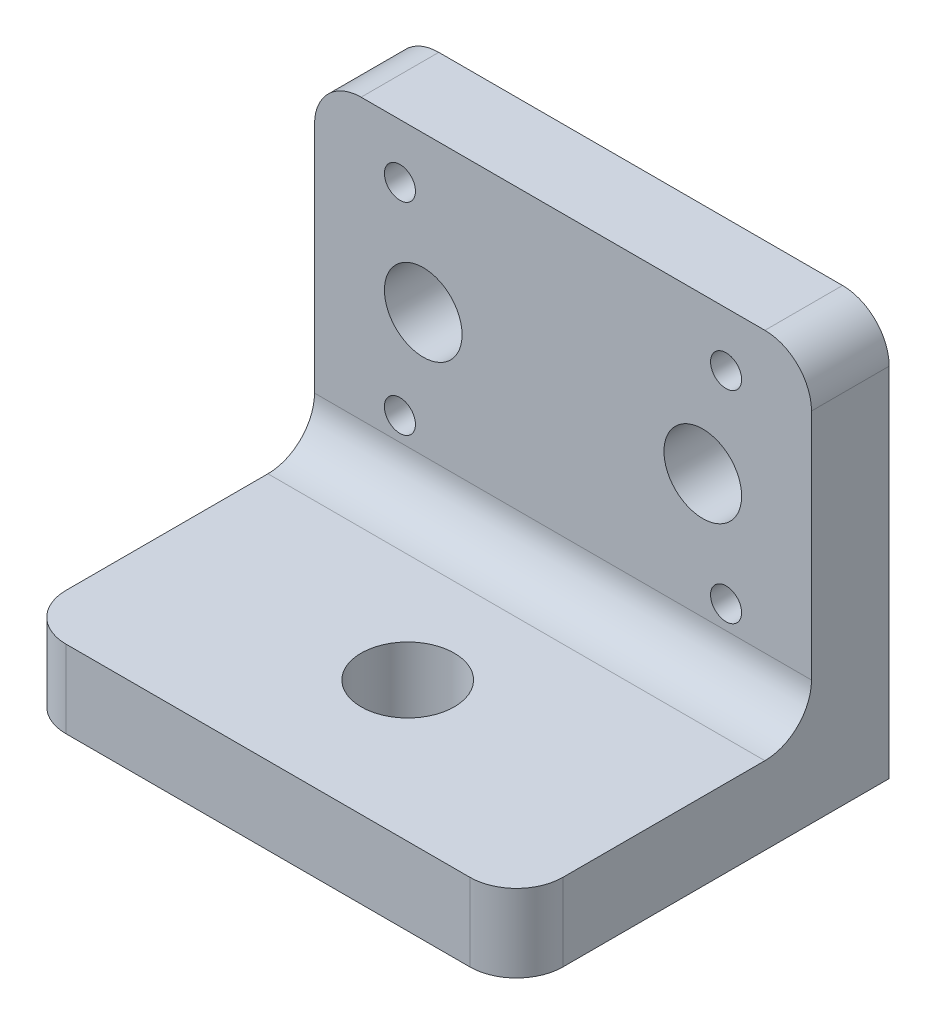
ISO-10303-21;
HEADER;
FILE_DESCRIPTION(('STEP AP214'),'2;1');
FILE_NAME('part.step','',(''),(''),'','','');
FILE_SCHEMA(('AUTOMOTIVE_DESIGN { 1 0 10303 214 1 1 1 1 }'));
ENDSEC;
DATA;
#1=APPLICATION_CONTEXT('core data for automotive mechanical design processes');
#2=APPLICATION_PROTOCOL_DEFINITION('international standard','automotive_design',2000,#1);
#3=PRODUCT_CONTEXT('',#1,'mechanical');
#4=PRODUCT('Part','Part','',(#3));
#5=PRODUCT_RELATED_PRODUCT_CATEGORY('part','',(#4));
#6=PRODUCT_DEFINITION_FORMATION('','',#4);
#7=PRODUCT_DEFINITION_CONTEXT('part definition',#1,'design');
#8=PRODUCT_DEFINITION('design','',#6,#7);
#9=PRODUCT_DEFINITION_SHAPE('','',#8);
#10=(LENGTH_UNIT() NAMED_UNIT(*) SI_UNIT(.MILLI.,.METRE.));
#11=(NAMED_UNIT(*) PLANE_ANGLE_UNIT() SI_UNIT($,.RADIAN.));
#12=(NAMED_UNIT(*) SI_UNIT($,.STERADIAN.) SOLID_ANGLE_UNIT());
#13=UNCERTAINTY_MEASURE_WITH_UNIT(LENGTH_MEASURE(1.E-05),#10,'distance_accuracy_value','');
#14=(GEOMETRIC_REPRESENTATION_CONTEXT(3) GLOBAL_UNCERTAINTY_ASSIGNED_CONTEXT((#13)) GLOBAL_UNIT_ASSIGNED_CONTEXT((#10,
#11,#12)) REPRESENTATION_CONTEXT('',''));
#15=CARTESIAN_POINT('',(0.,0.,0.));
#16=DIRECTION('',(0.,0.,1.));
#17=DIRECTION('',(1.,0.,0.));
#18=AXIS2_PLACEMENT_3D('',#15,#16,#17);
#19=CARTESIAN_POINT('',(-16.,16.,5.));
#20=DIRECTION('',(1.,0.,0.));
#21=DIRECTION('',(0.,0.,-1.));
#22=AXIS2_PLACEMENT_3D('',#19,#20,#21);
#23=PLANE('',#22);
#24=DIRECTION('',(0.,-1.,0.));
#25=VECTOR('',#24,1.);
#26=CARTESIAN_POINT('',(-16.,16.,5.));
#27=LINE('',#26,#25);
#28=CARTESIAN_POINT('',(-16.,7.,5.));
#29=VERTEX_POINT('',#28);
#30=CARTESIAN_POINT('',(-16.,-8.,5.));
#31=VERTEX_POINT('',#30);
#32=EDGE_CURVE('E145',#29,#31,#27,.T.);
#33=ORIENTED_EDGE('',*,*,#32,.F.);
#34=DIRECTION('',(0.,0.,1.));
#35=VECTOR('',#34,1.);
#36=CARTESIAN_POINT('',(-16.,7.,0.));
#37=LINE('',#36,#35);
#38=CARTESIAN_POINT('',(-16.,7.,0.));
#39=VERTEX_POINT('',#38);
#40=EDGE_CURVE('E135',#29,#39,#37,.F.);
#41=ORIENTED_EDGE('',*,*,#40,.T.);
#42=DIRECTION('',(0.,-1.,0.));
#43=VECTOR('',#42,1.);
#44=CARTESIAN_POINT('',(-16.,16.,0.));
#45=LINE('',#44,#43);
#46=CARTESIAN_POINT('',(-16.,-16.,0.));
#47=VERTEX_POINT('',#46);
#48=EDGE_CURVE('E132',#39,#47,#45,.T.);
#49=ORIENTED_EDGE('',*,*,#48,.T.);
#50=DIRECTION('',(0.,0.,-1.));
#51=VECTOR('',#50,1.);
#52=CARTESIAN_POINT('',(-16.,-16.,5.));
#53=LINE('',#52,#51);
#54=CARTESIAN_POINT('',(-16.,-16.,21.));
#55=VERTEX_POINT('',#54);
#56=EDGE_CURVE('E117',#55,#47,#53,.T.);
#57=ORIENTED_EDGE('',*,*,#56,.F.);
#58=DIRECTION('',(0.,-1.,0.));
#59=VECTOR('',#58,1.);
#60=CARTESIAN_POINT('',(-16.,16.,21.));
#61=LINE('',#60,#59);
#62=CARTESIAN_POINT('',(-16.,-11.,21.));
#63=VERTEX_POINT('',#62);
#64=EDGE_CURVE('E170',#55,#63,#61,.F.);
#65=ORIENTED_EDGE('',*,*,#64,.T.);
#66=DIRECTION('',(0.,0.,-1.));
#67=VECTOR('',#66,1.);
#68=CARTESIAN_POINT('',(-16.,-11.,24.));
#69=LINE('',#68,#67);
#70=CARTESIAN_POINT('',(-16.,-11.,8.));
#71=VERTEX_POINT('',#70);
#72=EDGE_CURVE('E187',#63,#71,#69,.T.);
#73=ORIENTED_EDGE('',*,*,#72,.T.);
#74=CARTESIAN_POINT('',(-16.,-8.,8.));
#75=DIRECTION('',(1.,0.,0.));
#76=DIRECTION('',(0.,0.,-1.));
#77=AXIS2_PLACEMENT_3D('',#74,#75,#76);
#78=CIRCLE('',#77,3.);
#79=EDGE_CURVE('E40',#71,#31,#78,.T.);
#80=ORIENTED_EDGE('',*,*,#79,.T.);
#81=EDGE_LOOP('',(#33,#41,#49,#57,#65,#73,#80));
#82=FACE_BOUND('',#81,.T.);
#83=ADVANCED_FACE('F32',(#82),#23,.F.);
#84=CARTESIAN_POINT('',(16.,16.,5.));
#85=DIRECTION('',(-1.,0.,0.));
#86=DIRECTION('',(0.,0.,1.));
#87=AXIS2_PLACEMENT_3D('',#84,#85,#86);
#88=PLANE('',#87);
#89=DIRECTION('',(0.,1.,0.));
#90=VECTOR('',#89,1.);
#91=CARTESIAN_POINT('',(16.,16.,0.));
#92=LINE('',#91,#90);
#93=CARTESIAN_POINT('',(16.,-16.,0.));
#94=VERTEX_POINT('',#93);
#95=CARTESIAN_POINT('',(16.,7.,0.));
#96=VERTEX_POINT('',#95);
#97=EDGE_CURVE('E143',#94,#96,#92,.T.);
#98=ORIENTED_EDGE('',*,*,#97,.T.);
#99=DIRECTION('',(0.,0.,-1.));
#100=VECTOR('',#99,1.);
#101=CARTESIAN_POINT('',(16.,7.,5.));
#102=LINE('',#101,#100);
#103=CARTESIAN_POINT('',(16.,7.,5.));
#104=VERTEX_POINT('',#103);
#105=EDGE_CURVE('E162',#96,#104,#102,.F.);
#106=ORIENTED_EDGE('',*,*,#105,.T.);
#107=DIRECTION('',(0.,1.,0.));
#108=VECTOR('',#107,1.);
#109=CARTESIAN_POINT('',(16.,16.,5.));
#110=LINE('',#109,#108);
#111=CARTESIAN_POINT('',(16.,-8.,5.));
#112=VERTEX_POINT('',#111);
#113=EDGE_CURVE('E149',#112,#104,#110,.T.);
#114=ORIENTED_EDGE('',*,*,#113,.F.);
#115=CARTESIAN_POINT('',(16.,-8.,8.));
#116=DIRECTION('',(-1.,0.,0.));
#117=DIRECTION('',(0.,0.,1.));
#118=AXIS2_PLACEMENT_3D('',#115,#116,#117);
#119=CIRCLE('',#118,3.);
#120=CARTESIAN_POINT('',(16.,-11.,8.));
#121=VERTEX_POINT('',#120);
#122=EDGE_CURVE('E11',#112,#121,#119,.T.);
#123=ORIENTED_EDGE('',*,*,#122,.T.);
#124=DIRECTION('',(0.,0.,-1.));
#125=VECTOR('',#124,1.);
#126=CARTESIAN_POINT('',(16.,-11.,24.));
#127=LINE('',#126,#125);
#128=CARTESIAN_POINT('',(16.,-11.,21.));
#129=VERTEX_POINT('',#128);
#130=EDGE_CURVE('E202',#129,#121,#127,.T.);
#131=ORIENTED_EDGE('',*,*,#130,.F.);
#132=DIRECTION('',(0.,1.,0.));
#133=VECTOR('',#132,1.);
#134=CARTESIAN_POINT('',(16.,16.,21.));
#135=LINE('',#134,#133);
#136=CARTESIAN_POINT('',(16.,-16.,21.));
#137=VERTEX_POINT('',#136);
#138=EDGE_CURVE('E160',#129,#137,#135,.F.);
#139=ORIENTED_EDGE('',*,*,#138,.T.);
#140=DIRECTION('',(0.,0.,-1.));
#141=VECTOR('',#140,1.);
#142=CARTESIAN_POINT('',(16.,-16.,5.));
#143=LINE('',#142,#141);
#144=EDGE_CURVE('E129',#137,#94,#143,.T.);
#145=ORIENTED_EDGE('',*,*,#144,.T.);
#146=EDGE_LOOP('',(#98,#106,#114,#123,#131,#139,#145));
#147=FACE_BOUND('',#146,.T.);
#148=ADVANCED_FACE('F201',(#147),#88,.F.);
#149=CARTESIAN_POINT('',(0.,0.,5.));
#150=DIRECTION('',(0.,0.,1.));
#151=DIRECTION('',(1.,0.,0.));
#152=AXIS2_PLACEMENT_3D('',#149,#150,#151);
#153=PLANE('',#152);
#154=CARTESIAN_POINT('',(-10.5,6.5,5.));
#155=DIRECTION('',(0.,0.,1.));
#156=DIRECTION('',(1.,0.,0.));
#157=AXIS2_PLACEMENT_3D('',#154,#155,#156);
#158=CIRCLE('',#157,0.99999999999999);
#159=CARTESIAN_POINT('',(-9.50000000000001,6.5,5.));
#160=VERTEX_POINT('',#159);
#161=EDGE_CURVE('E205',#160,#160,#158,.T.);
#162=ORIENTED_EDGE('',*,*,#161,.F.);
#163=EDGE_LOOP('',(#162));
#164=FACE_BOUND('',#163,.T.);
#165=CARTESIAN_POINT('',(10.5,6.5,5.));
#166=DIRECTION('',(0.,0.,1.));
#167=DIRECTION('',(1.,0.,0.));
#168=AXIS2_PLACEMENT_3D('',#165,#166,#167);
#169=CIRCLE('',#168,0.99999999999999);
#170=CARTESIAN_POINT('',(11.5,6.5,5.));
#171=VERTEX_POINT('',#170);
#172=EDGE_CURVE('E216',#171,#171,#169,.T.);
#173=ORIENTED_EDGE('',*,*,#172,.F.);
#174=EDGE_LOOP('',(#173));
#175=FACE_BOUND('',#174,.T.);
#176=CARTESIAN_POINT('',(10.5,-6.5,5.));
#177=DIRECTION('',(0.,0.,1.));
#178=DIRECTION('',(1.,0.,0.));
#179=AXIS2_PLACEMENT_3D('',#176,#177,#178);
#180=CIRCLE('',#179,0.99999999999999);
#181=CARTESIAN_POINT('',(11.5,-6.5,5.));
#182=VERTEX_POINT('',#181);
#183=EDGE_CURVE('E222',#182,#182,#180,.T.);
#184=ORIENTED_EDGE('',*,*,#183,.F.);
#185=EDGE_LOOP('',(#184));
#186=FACE_BOUND('',#185,.T.);
#187=CARTESIAN_POINT('',(-10.5,-6.5,5.));
#188=DIRECTION('',(0.,0.,1.));
#189=DIRECTION('',(1.,0.,0.));
#190=AXIS2_PLACEMENT_3D('',#187,#188,#189);
#191=CIRCLE('',#190,0.99999999999999);
#192=CARTESIAN_POINT('',(-9.50000000000001,-6.5,5.));
#193=VERTEX_POINT('',#192);
#194=EDGE_CURVE('E228',#193,#193,#191,.T.);
#195=ORIENTED_EDGE('',*,*,#194,.F.);
#196=EDGE_LOOP('',(#195));
#197=FACE_BOUND('',#196,.T.);
#198=CARTESIAN_POINT('',(-9.,0.,5.));
#199=DIRECTION('',(0.,0.,1.));
#200=DIRECTION('',(1.,0.,0.));
#201=AXIS2_PLACEMENT_3D('',#198,#199,#200);
#202=CIRCLE('',#201,2.49999999999999);
#203=CARTESIAN_POINT('',(-6.50000000000001,0.,5.));
#204=VERTEX_POINT('',#203);
#205=EDGE_CURVE('E234',#204,#204,#202,.T.);
#206=ORIENTED_EDGE('',*,*,#205,.F.);
#207=EDGE_LOOP('',(#206));
#208=FACE_BOUND('',#207,.T.);
#209=CARTESIAN_POINT('',(9.,0.,5.));
#210=DIRECTION('',(0.,0.,1.));
#211=DIRECTION('',(1.,0.,0.));
#212=AXIS2_PLACEMENT_3D('',#209,#210,#211);
#213=CIRCLE('',#212,2.49999999999999);
#214=CARTESIAN_POINT('',(11.5,0.,5.));
#215=VERTEX_POINT('',#214);
#216=EDGE_CURVE('E240',#215,#215,#213,.T.);
#217=ORIENTED_EDGE('',*,*,#216,.F.);
#218=EDGE_LOOP('',(#217));
#219=FACE_BOUND('',#218,.T.);
#220=ORIENTED_EDGE('',*,*,#113,.T.);
#221=CARTESIAN_POINT('',(13.,7.,5.));
#222=DIRECTION('',(0.,0.,1.));
#223=DIRECTION('',(1.,0.,0.));
#224=AXIS2_PLACEMENT_3D('',#221,#222,#223);
#225=CIRCLE('',#224,3.);
#226=CARTESIAN_POINT('',(13.,10.,5.));
#227=VERTEX_POINT('',#226);
#228=EDGE_CURVE('E168',#104,#227,#225,.T.);
#229=ORIENTED_EDGE('',*,*,#228,.T.);
#230=DIRECTION('',(1.,0.,0.));
#231=VECTOR('',#230,1.);
#232=CARTESIAN_POINT('',(-16.,10.,5.));
#233=LINE('',#232,#231);
#234=CARTESIAN_POINT('',(-13.,10.,5.));
#235=VERTEX_POINT('',#234);
#236=EDGE_CURVE('E255',#235,#227,#233,.T.);
#237=ORIENTED_EDGE('',*,*,#236,.F.);
#238=CARTESIAN_POINT('',(-13.,7.,5.));
#239=DIRECTION('',(0.,0.,1.));
#240=DIRECTION('',(1.,0.,0.));
#241=AXIS2_PLACEMENT_3D('',#238,#239,#240);
#242=CIRCLE('',#241,3.);
#243=EDGE_CURVE('E166',#235,#29,#242,.T.);
#244=ORIENTED_EDGE('',*,*,#243,.T.);
#245=ORIENTED_EDGE('',*,*,#32,.T.);
#246=DIRECTION('',(-1.,0.,0.));
#247=VECTOR('',#246,1.);
#248=CARTESIAN_POINT('',(0.,-8.,5.));
#249=LINE('',#248,#247);
#250=EDGE_CURVE('E164',#31,#112,#249,.F.);
#251=ORIENTED_EDGE('',*,*,#250,.T.);
#252=EDGE_LOOP('',(#220,#229,#237,#244,#245,#251));
#253=FACE_BOUND('',#252,.T.);
#254=ADVANCED_FACE('F193',(#164,#175,#186,#197,#208,#219,#253),#153,.T.);
#255=CARTESIAN_POINT('',(0.,0.,0.));
#256=DIRECTION('',(0.,0.,1.));
#257=DIRECTION('',(1.,0.,0.));
#258=AXIS2_PLACEMENT_3D('',#255,#256,#257);
#259=PLANE('',#258);
#260=CARTESIAN_POINT('',(9.,0.,0.));
#261=DIRECTION('',(0.,0.,1.));
#262=DIRECTION('',(1.,0.,0.));
#263=AXIS2_PLACEMENT_3D('',#260,#261,#262);
#264=CIRCLE('',#263,2.49999999999999);
#265=CARTESIAN_POINT('',(11.5,0.,0.));
#266=VERTEX_POINT('',#265);
#267=EDGE_CURVE('E138',#266,#266,#264,.T.);
#268=ORIENTED_EDGE('',*,*,#267,.T.);
#269=EDGE_LOOP('',(#268));
#270=FACE_BOUND('',#269,.T.);
#271=CARTESIAN_POINT('',(-9.,0.,0.));
#272=DIRECTION('',(0.,0.,1.));
#273=DIRECTION('',(1.,0.,0.));
#274=AXIS2_PLACEMENT_3D('',#271,#272,#273);
#275=CIRCLE('',#274,2.49999999999999);
#276=CARTESIAN_POINT('',(-6.5,0.,0.));
#277=VERTEX_POINT('',#276);
#278=EDGE_CURVE('E237',#277,#277,#275,.T.);
#279=ORIENTED_EDGE('',*,*,#278,.T.);
#280=EDGE_LOOP('',(#279));
#281=FACE_BOUND('',#280,.T.);
#282=CARTESIAN_POINT('',(-10.5,-6.5,0.));
#283=DIRECTION('',(0.,0.,1.));
#284=DIRECTION('',(1.,0.,0.));
#285=AXIS2_PLACEMENT_3D('',#282,#283,#284);
#286=CIRCLE('',#285,0.999999999999995);
#287=CARTESIAN_POINT('',(-9.50000000000001,-6.5,0.));
#288=VERTEX_POINT('',#287);
#289=EDGE_CURVE('E231',#288,#288,#286,.T.);
#290=ORIENTED_EDGE('',*,*,#289,.T.);
#291=EDGE_LOOP('',(#290));
#292=FACE_BOUND('',#291,.T.);
#293=CARTESIAN_POINT('',(10.5,-6.5,0.));
#294=DIRECTION('',(0.,0.,1.));
#295=DIRECTION('',(1.,0.,0.));
#296=AXIS2_PLACEMENT_3D('',#293,#294,#295);
#297=CIRCLE('',#296,0.999999999999995);
#298=CARTESIAN_POINT('',(11.5,-6.5,0.));
#299=VERTEX_POINT('',#298);
#300=EDGE_CURVE('E225',#299,#299,#297,.T.);
#301=ORIENTED_EDGE('',*,*,#300,.T.);
#302=EDGE_LOOP('',(#301));
#303=FACE_BOUND('',#302,.T.);
#304=CARTESIAN_POINT('',(10.5,6.5,0.));
#305=DIRECTION('',(0.,0.,1.));
#306=DIRECTION('',(1.,0.,0.));
#307=AXIS2_PLACEMENT_3D('',#304,#305,#306);
#308=CIRCLE('',#307,0.999999999999995);
#309=CARTESIAN_POINT('',(11.5,6.5,0.));
#310=VERTEX_POINT('',#309);
#311=EDGE_CURVE('E219',#310,#310,#308,.T.);
#312=ORIENTED_EDGE('',*,*,#311,.T.);
#313=EDGE_LOOP('',(#312));
#314=FACE_BOUND('',#313,.T.);
#315=CARTESIAN_POINT('',(-10.5,6.5,0.));
#316=DIRECTION('',(0.,0.,1.));
#317=DIRECTION('',(1.,0.,0.));
#318=AXIS2_PLACEMENT_3D('',#315,#316,#317);
#319=CIRCLE('',#318,0.999999999999995);
#320=CARTESIAN_POINT('',(-9.50000000000001,6.5,0.));
#321=VERTEX_POINT('',#320);
#322=EDGE_CURVE('E208',#321,#321,#319,.T.);
#323=ORIENTED_EDGE('',*,*,#322,.T.);
#324=EDGE_LOOP('',(#323));
#325=FACE_BOUND('',#324,.T.);
#326=DIRECTION('',(-1.,0.,0.));
#327=VECTOR('',#326,1.);
#328=CARTESIAN_POINT('',(16.,10.,0.));
#329=LINE('',#328,#327);
#330=CARTESIAN_POINT('',(13.,10.,0.));
#331=VERTEX_POINT('',#330);
#332=CARTESIAN_POINT('',(-13.,10.,0.));
#333=VERTEX_POINT('',#332);
#334=EDGE_CURVE('E253',#331,#333,#329,.T.);
#335=ORIENTED_EDGE('',*,*,#334,.F.);
#336=CARTESIAN_POINT('',(13.,7.,0.));
#337=DIRECTION('',(0.,0.,1.));
#338=DIRECTION('',(1.,0.,0.));
#339=AXIS2_PLACEMENT_3D('',#336,#337,#338);
#340=CIRCLE('',#339,3.);
#341=EDGE_CURVE('E158',#331,#96,#340,.F.);
#342=ORIENTED_EDGE('',*,*,#341,.T.);
#343=ORIENTED_EDGE('',*,*,#97,.F.);
#344=DIRECTION('',(1.,0.,0.));
#345=VECTOR('',#344,1.);
#346=CARTESIAN_POINT('',(-16.,-16.,0.));
#347=LINE('',#346,#345);
#348=EDGE_CURVE('E123',#47,#94,#347,.T.);
#349=ORIENTED_EDGE('',*,*,#348,.F.);
#350=ORIENTED_EDGE('',*,*,#48,.F.);
#351=CARTESIAN_POINT('',(-13.,7.,0.));
#352=DIRECTION('',(0.,0.,1.));
#353=DIRECTION('',(1.,0.,0.));
#354=AXIS2_PLACEMENT_3D('',#351,#352,#353);
#355=CIRCLE('',#354,3.);
#356=EDGE_CURVE('E156',#39,#333,#355,.F.);
#357=ORIENTED_EDGE('',*,*,#356,.T.);
#358=EDGE_LOOP('',(#335,#342,#343,#349,#350,#357));
#359=FACE_BOUND('',#358,.T.);
#360=ADVANCED_FACE('F141',(#270,#281,#292,#303,#314,#325,#359),#259,.F.);
#361=CARTESIAN_POINT('',(-16.,-11.,24.));
#362=DIRECTION('',(0.,-1.,0.));
#363=DIRECTION('',(0.,0.,-1.));
#364=AXIS2_PLACEMENT_3D('',#361,#362,#363);
#365=PLANE('',#364);
#366=ORIENTED_EDGE('',*,*,#72,.F.);
#367=CARTESIAN_POINT('',(-13.,-11.,21.));
#368=DIRECTION('',(0.,-1.,0.));
#369=DIRECTION('',(0.,0.,-1.));
#370=AXIS2_PLACEMENT_3D('',#367,#368,#369);
#371=CIRCLE('',#370,3.);
#372=CARTESIAN_POINT('',(-13.,-11.,24.));
#373=VERTEX_POINT('',#372);
#374=EDGE_CURVE('E47',#63,#373,#371,.F.);
#375=ORIENTED_EDGE('',*,*,#374,.T.);
#376=DIRECTION('',(-1.,0.,0.));
#377=VECTOR('',#376,1.);
#378=CARTESIAN_POINT('',(-16.,-11.,24.));
#379=LINE('',#378,#377);
#380=CARTESIAN_POINT('',(13.,-11.,24.));
#381=VERTEX_POINT('',#380);
#382=EDGE_CURVE('E210',#381,#373,#379,.T.);
#383=ORIENTED_EDGE('',*,*,#382,.F.);
#384=CARTESIAN_POINT('',(13.,-11.,21.));
#385=DIRECTION('',(0.,-1.,0.));
#386=DIRECTION('',(0.,0.,-1.));
#387=AXIS2_PLACEMENT_3D('',#384,#385,#386);
#388=CIRCLE('',#387,3.);
#389=EDGE_CURVE('E55',#381,#129,#388,.F.);
#390=ORIENTED_EDGE('',*,*,#389,.T.);
#391=ORIENTED_EDGE('',*,*,#130,.T.);
#392=DIRECTION('',(-1.,0.,0.));
#393=VECTOR('',#392,1.);
#394=CARTESIAN_POINT('',(-16.,-11.,8.));
#395=LINE('',#394,#393);
#396=EDGE_CURVE('E181',#121,#71,#395,.T.);
#397=ORIENTED_EDGE('',*,*,#396,.T.);
#398=EDGE_LOOP('',(#366,#375,#383,#390,#391,#397));
#399=FACE_BOUND('',#398,.T.);
#400=CARTESIAN_POINT('',(0.,-11.,15.));
#401=DIRECTION('',(0.,1.,0.));
#402=DIRECTION('',(0.,0.,1.));
#403=AXIS2_PLACEMENT_3D('',#400,#401,#402);
#404=CIRCLE('',#403,3.);
#405=CARTESIAN_POINT('',(0.,-11.,18.));
#406=VERTEX_POINT('',#405);
#407=EDGE_CURVE('E257',#406,#406,#404,.T.);
#408=ORIENTED_EDGE('',*,*,#407,.F.);
#409=EDGE_LOOP('',(#408));
#410=FACE_BOUND('',#409,.T.);
#411=ADVANCED_FACE('F203',(#399,#410),#365,.F.);
#412=CARTESIAN_POINT('',(-16.,-16.,5.));
#413=DIRECTION('',(0.,1.,0.));
#414=DIRECTION('',(0.,0.,1.));
#415=AXIS2_PLACEMENT_3D('',#412,#413,#414);
#416=PLANE('',#415);
#417=CARTESIAN_POINT('',(0.,-16.,15.));
#418=DIRECTION('',(0.,1.,0.));
#419=DIRECTION('',(0.,0.,1.));
#420=AXIS2_PLACEMENT_3D('',#417,#418,#419);
#421=CIRCLE('',#420,3.);
#422=CARTESIAN_POINT('',(0.,-16.,18.));
#423=VERTEX_POINT('',#422);
#424=EDGE_CURVE('E262',#423,#423,#421,.T.);
#425=ORIENTED_EDGE('',*,*,#424,.T.);
#426=EDGE_LOOP('',(#425));
#427=FACE_BOUND('',#426,.T.);
#428=DIRECTION('',(1.,0.,0.));
#429=VECTOR('',#428,1.);
#430=CARTESIAN_POINT('',(-16.,-16.,24.));
#431=LINE('',#430,#429);
#432=CARTESIAN_POINT('',(-13.,-16.,24.));
#433=VERTEX_POINT('',#432);
#434=CARTESIAN_POINT('',(13.,-16.,24.));
#435=VERTEX_POINT('',#434);
#436=EDGE_CURVE('E265',#433,#435,#431,.T.);
#437=ORIENTED_EDGE('',*,*,#436,.F.);
#438=CARTESIAN_POINT('',(-13.,-16.,21.));
#439=DIRECTION('',(0.,1.,0.));
#440=DIRECTION('',(0.,0.,1.));
#441=AXIS2_PLACEMENT_3D('',#438,#439,#440);
#442=CIRCLE('',#441,3.);
#443=EDGE_CURVE('E125',#433,#55,#442,.F.);
#444=ORIENTED_EDGE('',*,*,#443,.T.);
#445=ORIENTED_EDGE('',*,*,#56,.T.);
#446=ORIENTED_EDGE('',*,*,#348,.T.);
#447=ORIENTED_EDGE('',*,*,#144,.F.);
#448=CARTESIAN_POINT('',(13.,-16.,21.));
#449=DIRECTION('',(0.,1.,0.));
#450=DIRECTION('',(0.,0.,1.));
#451=AXIS2_PLACEMENT_3D('',#448,#449,#450);
#452=CIRCLE('',#451,3.);
#453=EDGE_CURVE('E178',#137,#435,#452,.F.);
#454=ORIENTED_EDGE('',*,*,#453,.T.);
#455=EDGE_LOOP('',(#437,#444,#445,#446,#447,#454));
#456=FACE_BOUND('',#455,.T.);
#457=ADVANCED_FACE('F120',(#427,#456),#416,.F.);
#458=CARTESIAN_POINT('',(9.,0.,5.));
#459=DIRECTION('',(0.,0.,1.));
#460=DIRECTION('',(1.,0.,0.));
#461=AXIS2_PLACEMENT_3D('',#458,#459,#460);
#462=CYLINDRICAL_SURFACE('',#461,2.49999999999999);
#463=ORIENTED_EDGE('',*,*,#267,.F.);
#464=EDGE_LOOP('',(#463));
#465=FACE_BOUND('',#464,.T.);
#466=ORIENTED_EDGE('',*,*,#216,.T.);
#467=EDGE_LOOP('',(#466));
#468=FACE_BOUND('',#467,.T.);
#469=ADVANCED_FACE('F325',(#465,#468),#462,.F.);
#470=CARTESIAN_POINT('',(-9.,0.,5.));
#471=DIRECTION('',(0.,0.,1.));
#472=DIRECTION('',(1.,0.,0.));
#473=AXIS2_PLACEMENT_3D('',#470,#471,#472);
#474=CYLINDRICAL_SURFACE('',#473,2.49999999999999);
#475=ORIENTED_EDGE('',*,*,#278,.F.);
#476=EDGE_LOOP('',(#475));
#477=FACE_BOUND('',#476,.T.);
#478=ORIENTED_EDGE('',*,*,#205,.T.);
#479=EDGE_LOOP('',(#478));
#480=FACE_BOUND('',#479,.T.);
#481=ADVANCED_FACE('F321',(#477,#480),#474,.F.);
#482=CARTESIAN_POINT('',(-10.5,-6.5,5.));
#483=DIRECTION('',(0.,0.,1.));
#484=DIRECTION('',(1.,0.,0.));
#485=AXIS2_PLACEMENT_3D('',#482,#483,#484);
#486=CYLINDRICAL_SURFACE('',#485,0.999999999999995);
#487=ORIENTED_EDGE('',*,*,#289,.F.);
#488=EDGE_LOOP('',(#487));
#489=FACE_BOUND('',#488,.T.);
#490=ORIENTED_EDGE('',*,*,#194,.T.);
#491=EDGE_LOOP('',(#490));
#492=FACE_BOUND('',#491,.T.);
#493=ADVANCED_FACE('F317',(#489,#492),#486,.F.);
#494=CARTESIAN_POINT('',(10.5,-6.5,5.));
#495=DIRECTION('',(0.,0.,1.));
#496=DIRECTION('',(1.,0.,0.));
#497=AXIS2_PLACEMENT_3D('',#494,#495,#496);
#498=CYLINDRICAL_SURFACE('',#497,0.999999999999995);
#499=ORIENTED_EDGE('',*,*,#300,.F.);
#500=EDGE_LOOP('',(#499));
#501=FACE_BOUND('',#500,.T.);
#502=ORIENTED_EDGE('',*,*,#183,.T.);
#503=EDGE_LOOP('',(#502));
#504=FACE_BOUND('',#503,.T.);
#505=ADVANCED_FACE('F313',(#501,#504),#498,.F.);
#506=CARTESIAN_POINT('',(10.5,6.5,5.));
#507=DIRECTION('',(0.,0.,1.));
#508=DIRECTION('',(1.,0.,0.));
#509=AXIS2_PLACEMENT_3D('',#506,#507,#508);
#510=CYLINDRICAL_SURFACE('',#509,0.999999999999995);
#511=ORIENTED_EDGE('',*,*,#311,.F.);
#512=EDGE_LOOP('',(#511));
#513=FACE_BOUND('',#512,.T.);
#514=ORIENTED_EDGE('',*,*,#172,.T.);
#515=EDGE_LOOP('',(#514));
#516=FACE_BOUND('',#515,.T.);
#517=ADVANCED_FACE('F309',(#513,#516),#510,.F.);
#518=CARTESIAN_POINT('',(-10.5,6.5,5.));
#519=DIRECTION('',(0.,0.,1.));
#520=DIRECTION('',(1.,0.,0.));
#521=AXIS2_PLACEMENT_3D('',#518,#519,#520);
#522=CYLINDRICAL_SURFACE('',#521,0.999999999999995);
#523=ORIENTED_EDGE('',*,*,#322,.F.);
#524=EDGE_LOOP('',(#523));
#525=FACE_BOUND('',#524,.T.);
#526=ORIENTED_EDGE('',*,*,#161,.T.);
#527=EDGE_LOOP('',(#526));
#528=FACE_BOUND('',#527,.T.);
#529=ADVANCED_FACE('F304',(#525,#528),#522,.F.);
#530=CARTESIAN_POINT('',(0.,0.,24.));
#531=DIRECTION('',(0.,0.,-1.));
#532=DIRECTION('',(-1.,0.,0.));
#533=AXIS2_PLACEMENT_3D('',#530,#531,#532);
#534=PLANE('',#533);
#535=ORIENTED_EDGE('',*,*,#382,.T.);
#536=DIRECTION('',(0.,-1.,0.));
#537=VECTOR('',#536,1.);
#538=CARTESIAN_POINT('',(-13.,0.,24.));
#539=LINE('',#538,#537);
#540=EDGE_CURVE('E175',#373,#433,#539,.T.);
#541=ORIENTED_EDGE('',*,*,#540,.T.);
#542=ORIENTED_EDGE('',*,*,#436,.T.);
#543=DIRECTION('',(0.,1.,0.));
#544=VECTOR('',#543,1.);
#545=CARTESIAN_POINT('',(13.,0.,24.));
#546=LINE('',#545,#544);
#547=EDGE_CURVE('E173',#435,#381,#546,.T.);
#548=ORIENTED_EDGE('',*,*,#547,.T.);
#549=EDGE_LOOP('',(#535,#541,#542,#548));
#550=FACE_BOUND('',#549,.T.);
#551=ADVANCED_FACE('F269',(#550),#534,.F.);
#552=CARTESIAN_POINT('',(0.,-11.,15.));
#553=DIRECTION('',(0.,1.,0.));
#554=DIRECTION('',(0.,0.,1.));
#555=AXIS2_PLACEMENT_3D('',#552,#553,#554);
#556=CYLINDRICAL_SURFACE('',#555,3.);
#557=ORIENTED_EDGE('',*,*,#424,.F.);
#558=EDGE_LOOP('',(#557));
#559=FACE_BOUND('',#558,.T.);
#560=ORIENTED_EDGE('',*,*,#407,.T.);
#561=EDGE_LOOP('',(#560));
#562=FACE_BOUND('',#561,.T.);
#563=ADVANCED_FACE('F294',(#559,#562),#556,.F.);
#564=CARTESIAN_POINT('',(0.,10.,0.));
#565=DIRECTION('',(0.,1.,0.));
#566=DIRECTION('',(0.,0.,1.));
#567=AXIS2_PLACEMENT_3D('',#564,#565,#566);
#568=PLANE('',#567);
#569=ORIENTED_EDGE('',*,*,#236,.T.);
#570=DIRECTION('',(0.,0.,-1.));
#571=VECTOR('',#570,1.);
#572=CARTESIAN_POINT('',(13.,10.,0.));
#573=LINE('',#572,#571);
#574=EDGE_CURVE('E153',#227,#331,#573,.T.);
#575=ORIENTED_EDGE('',*,*,#574,.T.);
#576=ORIENTED_EDGE('',*,*,#334,.T.);
#577=DIRECTION('',(0.,0.,1.));
#578=VECTOR('',#577,1.);
#579=CARTESIAN_POINT('',(-13.,10.,5.));
#580=LINE('',#579,#578);
#581=EDGE_CURVE('E128',#333,#235,#580,.T.);
#582=ORIENTED_EDGE('',*,*,#581,.T.);
#583=EDGE_LOOP('',(#569,#575,#576,#582));
#584=FACE_BOUND('',#583,.T.);
#585=ADVANCED_FACE('F252',(#584),#568,.T.);
#586=CARTESIAN_POINT('',(13.,7.,0.));
#587=DIRECTION('',(0.,0.,1.));
#588=DIRECTION('',(1.,0.,0.));
#589=AXIS2_PLACEMENT_3D('',#586,#587,#588);
#590=CYLINDRICAL_SURFACE('',#589,3.);
#591=ORIENTED_EDGE('',*,*,#228,.F.);
#592=ORIENTED_EDGE('',*,*,#105,.F.);
#593=ORIENTED_EDGE('',*,*,#341,.F.);
#594=ORIENTED_EDGE('',*,*,#574,.F.);
#595=EDGE_LOOP('',(#591,#592,#593,#594));
#596=FACE_BOUND('',#595,.T.);
#597=ADVANCED_FACE('F249',(#596),#590,.T.);
#598=CARTESIAN_POINT('',(-13.,7.,0.));
#599=DIRECTION('',(0.,0.,-1.));
#600=DIRECTION('',(-1.,0.,0.));
#601=AXIS2_PLACEMENT_3D('',#598,#599,#600);
#602=CYLINDRICAL_SURFACE('',#601,3.);
#603=ORIENTED_EDGE('',*,*,#356,.F.);
#604=ORIENTED_EDGE('',*,*,#40,.F.);
#605=ORIENTED_EDGE('',*,*,#243,.F.);
#606=ORIENTED_EDGE('',*,*,#581,.F.);
#607=EDGE_LOOP('',(#603,#604,#605,#606));
#608=FACE_BOUND('',#607,.T.);
#609=ADVANCED_FACE('F274',(#608),#602,.T.);
#610=CARTESIAN_POINT('',(-13.,0.,21.));
#611=DIRECTION('',(0.,-1.,0.));
#612=DIRECTION('',(0.,0.,-1.));
#613=AXIS2_PLACEMENT_3D('',#610,#611,#612);
#614=CYLINDRICAL_SURFACE('',#613,3.);
#615=ORIENTED_EDGE('',*,*,#374,.F.);
#616=ORIENTED_EDGE('',*,*,#64,.F.);
#617=ORIENTED_EDGE('',*,*,#443,.F.);
#618=ORIENTED_EDGE('',*,*,#540,.F.);
#619=EDGE_LOOP('',(#615,#616,#617,#618));
#620=FACE_BOUND('',#619,.T.);
#621=ADVANCED_FACE('F271',(#620),#614,.T.);
#622=CARTESIAN_POINT('',(13.,0.,21.));
#623=DIRECTION('',(0.,1.,0.));
#624=DIRECTION('',(0.,0.,1.));
#625=AXIS2_PLACEMENT_3D('',#622,#623,#624);
#626=CYLINDRICAL_SURFACE('',#625,3.);
#627=ORIENTED_EDGE('',*,*,#453,.F.);
#628=ORIENTED_EDGE('',*,*,#138,.F.);
#629=ORIENTED_EDGE('',*,*,#389,.F.);
#630=ORIENTED_EDGE('',*,*,#547,.F.);
#631=EDGE_LOOP('',(#627,#628,#629,#630));
#632=FACE_BOUND('',#631,.T.);
#633=ADVANCED_FACE('F273',(#632),#626,.T.);
#634=CARTESIAN_POINT('',(-16.,-8.,8.));
#635=DIRECTION('',(-1.,0.,0.));
#636=DIRECTION('',(0.,0.,1.));
#637=AXIS2_PLACEMENT_3D('',#634,#635,#636);
#638=CYLINDRICAL_SURFACE('',#637,3.);
#639=ORIENTED_EDGE('',*,*,#122,.F.);
#640=ORIENTED_EDGE('',*,*,#250,.F.);
#641=ORIENTED_EDGE('',*,*,#79,.F.);
#642=ORIENTED_EDGE('',*,*,#396,.F.);
#643=EDGE_LOOP('',(#639,#640,#641,#642));
#644=FACE_BOUND('',#643,.T.);
#645=ADVANCED_FACE('F34',(#644),#638,.F.);
#646=CLOSED_SHELL('',(#83,#148,#254,#360,#411,#457,#469,#481,#493,#505,#517,#529,#551,#563,#585,
#597,#609,#621,#633,#645));
#647=MANIFOLD_SOLID_BREP('B2',#646);
#648=ADVANCED_BREP_SHAPE_REPRESENTATION('',(#18,#647),#14);
#649=SHAPE_DEFINITION_REPRESENTATION(#9,#648);
ENDSEC;
END-ISO-10303-21;
